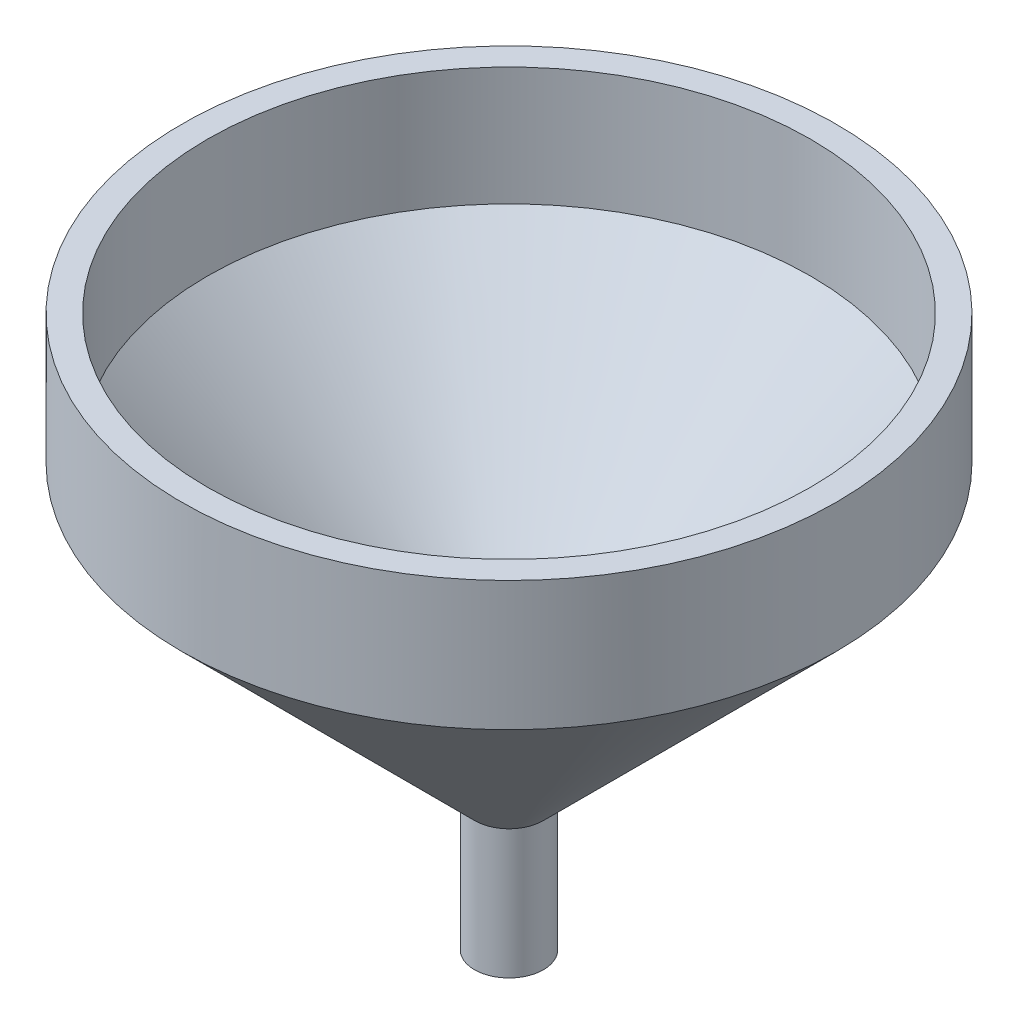
ISO-10303-21;
HEADER;
FILE_DESCRIPTION(('STEP AP214'),'2;1');
FILE_NAME('part.step','',(''),(''),'','','');
FILE_SCHEMA(('AUTOMOTIVE_DESIGN { 1 0 10303 214 1 1 1 1 }'));
ENDSEC;
DATA;
#1=APPLICATION_CONTEXT('core data for automotive mechanical design processes');
#2=APPLICATION_PROTOCOL_DEFINITION('international standard','automotive_design',2000,#1);
#3=PRODUCT_CONTEXT('',#1,'mechanical');
#4=PRODUCT('Part','Part','',(#3));
#5=PRODUCT_RELATED_PRODUCT_CATEGORY('part','',(#4));
#6=PRODUCT_DEFINITION_FORMATION('','',#4);
#7=PRODUCT_DEFINITION_CONTEXT('part definition',#1,'design');
#8=PRODUCT_DEFINITION('design','',#6,#7);
#9=PRODUCT_DEFINITION_SHAPE('','',#8);
#10=(LENGTH_UNIT() NAMED_UNIT(*) SI_UNIT(.MILLI.,.METRE.));
#11=(NAMED_UNIT(*) PLANE_ANGLE_UNIT() SI_UNIT($,.RADIAN.));
#12=(NAMED_UNIT(*) SI_UNIT($,.STERADIAN.) SOLID_ANGLE_UNIT());
#13=UNCERTAINTY_MEASURE_WITH_UNIT(LENGTH_MEASURE(1.E-05),#10,'distance_accuracy_value','');
#14=(GEOMETRIC_REPRESENTATION_CONTEXT(3) GLOBAL_UNCERTAINTY_ASSIGNED_CONTEXT((#13)) GLOBAL_UNIT_ASSIGNED_CONTEXT((#10,
#11,#12)) REPRESENTATION_CONTEXT('',''));
#15=CARTESIAN_POINT('',(0.,0.,0.));
#16=DIRECTION('',(0.,0.,1.));
#17=DIRECTION('',(1.,0.,0.));
#18=AXIS2_PLACEMENT_3D('',#15,#16,#17);
#19=CARTESIAN_POINT('',(0.,0.,0.));
#20=DIRECTION('',(0.,1.,0.));
#21=DIRECTION('',(-1.,0.,0.));
#22=AXIS2_PLACEMENT_3D('',#19,#20,#21);
#23=PLANE('',#22);
#24=CARTESIAN_POINT('',(2.,0.,0.));
#25=DIRECTION('',(0.,-1.,0.));
#26=DIRECTION('',(1.,0.,0.));
#27=AXIS2_PLACEMENT_3D('',#24,#25,#26);
#28=CIRCLE('',#27,2.);
#29=CARTESIAN_POINT('',(4.,0.,0.));
#30=VERTEX_POINT('',#29);
#31=EDGE_CURVE('E59',#30,#30,#28,.T.);
#32=ORIENTED_EDGE('',*,*,#31,.F.);
#33=EDGE_LOOP('',(#32));
#34=FACE_BOUND('',#33,.T.);
#35=CARTESIAN_POINT('',(2.,0.,0.));
#36=DIRECTION('',(0.,-1.,0.));
#37=DIRECTION('',(1.,0.,0.));
#38=AXIS2_PLACEMENT_3D('',#35,#36,#37);
#39=CIRCLE('',#38,4.);
#40=CARTESIAN_POINT('',(6.,0.,0.));
#41=VERTEX_POINT('',#40);
#42=EDGE_CURVE('E10',#41,#41,#39,.T.);
#43=ORIENTED_EDGE('',*,*,#42,.T.);
#44=EDGE_LOOP('',(#43));
#45=FACE_BOUND('',#44,.T.);
#46=ADVANCED_FACE('F31',(#34,#45),#23,.F.);
#47=CARTESIAN_POINT('',(2.,0.,0.));
#48=DIRECTION('',(0.,-1.,0.));
#49=DIRECTION('',(1.,0.,0.));
#50=AXIS2_PLACEMENT_3D('',#47,#48,#49);
#51=CYLINDRICAL_SURFACE('',#50,3.99999999999997);
#52=ORIENTED_EDGE('',*,*,#42,.F.);
#53=EDGE_LOOP('',(#52));
#54=FACE_BOUND('',#53,.T.);
#55=CARTESIAN_POINT('',(2.00000000000002,15.0000000000001,0.));
#56=DIRECTION('',(0.,-1.,0.));
#57=DIRECTION('',(1.,0.,0.));
#58=AXIS2_PLACEMENT_3D('',#55,#56,#57);
#59=CIRCLE('',#58,3.99999999999993);
#60=CARTESIAN_POINT('',(-1.99999999999992,15.0000000000001,0.));
#61=VERTEX_POINT('',#60);
#62=EDGE_CURVE('E37',#61,#61,#59,.T.);
#63=ORIENTED_EDGE('',*,*,#62,.T.);
#64=EDGE_LOOP('',(#63));
#65=FACE_BOUND('',#64,.T.);
#66=ADVANCED_FACE('F66',(#54,#65),#51,.T.);
#67=CARTESIAN_POINT('',(2.00000000000005,49.0000000000004,0.));
#68=DIRECTION('',(0.,1.,0.));
#69=DIRECTION('',(-1.,0.,0.));
#70=AXIS2_PLACEMENT_3D('',#67,#68,#69);
#71=CONICAL_SURFACE('',#70,38.,0.785398163397445);
#72=CARTESIAN_POINT('',(2.00000000000005,49.0000000000004,0.));
#73=DIRECTION('',(0.,-1.,0.));
#74=DIRECTION('',(1.,0.,0.));
#75=AXIS2_PLACEMENT_3D('',#72,#73,#74);
#76=CIRCLE('',#75,38.);
#77=CARTESIAN_POINT('',(-35.9999999999999,49.0000000000004,0.));
#78=VERTEX_POINT('',#77);
#79=EDGE_CURVE('E41',#78,#78,#76,.T.);
#80=CARTESIAN_POINT('',(-1.99999999999992,15.0000000000001,0.));
#81=CARTESIAN_POINT('',(-2.35416666666659,15.3541666666668,0.));
#82=CARTESIAN_POINT('',(-2.70833333333325,15.7083333333334,0.));
#83=CARTESIAN_POINT('',(-3.41666666666659,16.4166666666668,0.));
#84=CARTESIAN_POINT('',(-3.77083333333325,16.7708333333334,0.));
#85=CARTESIAN_POINT('',(-4.47916666666659,17.4791666666668,0.));
#86=CARTESIAN_POINT('',(-4.83333333333326,17.8333333333334,0.));
#87=CARTESIAN_POINT('',(-5.54166666666659,18.5416666666668,0.));
#88=CARTESIAN_POINT('',(-5.89583333333326,18.8958333333335,0.));
#89=CARTESIAN_POINT('',(-6.60416666666659,19.6041666666668,0.));
#90=CARTESIAN_POINT('',(-6.95833333333326,19.9583333333335,0.));
#91=CARTESIAN_POINT('',(-7.66666666666659,20.6666666666668,0.));
#92=CARTESIAN_POINT('',(-8.02083333333326,21.0208333333335,0.));
#93=CARTESIAN_POINT('',(-8.72916666666659,21.7291666666668,0.));
#94=CARTESIAN_POINT('',(-9.08333333333326,22.0833333333335,0.));
#95=CARTESIAN_POINT('',(-9.79166666666659,22.7916666666668,0.));
#96=CARTESIAN_POINT('',(-10.1458333333333,23.1458333333335,0.));
#97=CARTESIAN_POINT('',(-10.8541666666666,23.8541666666668,0.));
#98=CARTESIAN_POINT('',(-11.2083333333333,24.2083333333335,0.));
#99=CARTESIAN_POINT('',(-11.9166666666666,24.9166666666668,0.));
#100=CARTESIAN_POINT('',(-12.2708333333333,25.2708333333335,0.));
#101=CARTESIAN_POINT('',(-12.9791666666666,25.9791666666669,0.));
#102=CARTESIAN_POINT('',(-13.3333333333333,26.3333333333335,0.));
#103=CARTESIAN_POINT('',(-14.0416666666666,27.0416666666669,0.));
#104=CARTESIAN_POINT('',(-14.3958333333333,27.3958333333335,0.));
#105=CARTESIAN_POINT('',(-15.1041666666666,28.1041666666669,0.));
#106=CARTESIAN_POINT('',(-15.4583333333333,28.4583333333335,0.));
#107=CARTESIAN_POINT('',(-16.1666666666666,29.1666666666669,0.));
#108=CARTESIAN_POINT('',(-16.5208333333333,29.5208333333336,0.));
#109=CARTESIAN_POINT('',(-17.2291666666666,30.2291666666669,0.));
#110=CARTESIAN_POINT('',(-17.5833333333333,30.5833333333336,0.));
#111=CARTESIAN_POINT('',(-18.2916666666666,31.2916666666669,0.));
#112=CARTESIAN_POINT('',(-18.6458333333333,31.6458333333336,0.));
#113=CARTESIAN_POINT('',(-19.3541666666666,32.3541666666669,0.));
#114=CARTESIAN_POINT('',(-19.7083333333333,32.7083333333336,0.));
#115=CARTESIAN_POINT('',(-20.4166666666666,33.4166666666669,0.));
#116=CARTESIAN_POINT('',(-20.7708333333333,33.7708333333336,0.));
#117=CARTESIAN_POINT('',(-21.4791666666666,34.4791666666669,0.));
#118=CARTESIAN_POINT('',(-21.8333333333333,34.8333333333336,0.));
#119=CARTESIAN_POINT('',(-22.5416666666666,35.5416666666669,0.));
#120=CARTESIAN_POINT('',(-22.8958333333333,35.8958333333336,0.));
#121=CARTESIAN_POINT('',(-23.6041666666666,36.604166666667,0.));
#122=CARTESIAN_POINT('',(-23.9583333333333,36.9583333333336,0.));
#123=CARTESIAN_POINT('',(-24.6666666666666,37.666666666667,0.));
#124=CARTESIAN_POINT('',(-25.0208333333333,38.0208333333336,0.));
#125=CARTESIAN_POINT('',(-25.7291666666666,38.729166666667,0.));
#126=CARTESIAN_POINT('',(-26.0833333333333,39.0833333333337,0.));
#127=CARTESIAN_POINT('',(-26.7916666666666,39.791666666667,0.));
#128=CARTESIAN_POINT('',(-27.1458333333333,40.1458333333337,0.));
#129=CARTESIAN_POINT('',(-27.8541666666666,40.854166666667,0.));
#130=CARTESIAN_POINT('',(-28.2083333333333,41.2083333333337,0.));
#131=CARTESIAN_POINT('',(-28.9166666666666,41.916666666667,0.));
#132=CARTESIAN_POINT('',(-29.2708333333333,42.2708333333337,0.));
#133=CARTESIAN_POINT('',(-29.9791666666666,42.979166666667,0.));
#134=CARTESIAN_POINT('',(-30.3333333333333,43.3333333333337,0.));
#135=CARTESIAN_POINT('',(-31.0416666666666,44.041666666667,0.));
#136=CARTESIAN_POINT('',(-31.3958333333333,44.3958333333337,0.));
#137=CARTESIAN_POINT('',(-32.1041666666666,45.104166666667,0.));
#138=CARTESIAN_POINT('',(-32.4583333333333,45.4583333333337,0.));
#139=CARTESIAN_POINT('',(-33.1666666666666,46.1666666666671,0.));
#140=CARTESIAN_POINT('',(-33.5208333333333,46.5208333333337,0.));
#141=CARTESIAN_POINT('',(-34.2291666666666,47.2291666666671,0.));
#142=CARTESIAN_POINT('',(-34.5833333333333,47.5833333333337,0.));
#143=CARTESIAN_POINT('',(-35.2916666666666,48.2916666666671,0.));
#144=CARTESIAN_POINT('',(-35.6458333333333,48.6458333333337,0.));
#145=CARTESIAN_POINT('',(-35.9999999999999,49.0000000000004,0.));
#146=B_SPLINE_CURVE_WITH_KNOTS('',3,(#80,#81,#82,#83,#84,#85,#86,#87,#88,#89,#90,#91,#92,#93,
#94,#95,#96,#97,#98,#99,#100,#101,#102,#103,#104,#105,#106,#107,#108,#109,#110,#111,#112,#113,
#114,#115,#116,#117,#118,#119,#120,#121,#122,#123,#124,#125,#126,#127,#128,#129,#130,#131,#132,
#133,#134,#135,#136,#137,#138,#139,#140,#141,#142,#143,#144,#145),.UNSPECIFIED.,.F.,.F.,(4,2,2,
2,2,2,2,2,2,2,2,2,2,2,2,2,2,2,2,2,2,2,2,2,2,2,2,2,2,2,2,2,4),(0.,1.50260191002142,
3.00520382004284,4.50780573006426,6.01040764008568,7.5130095501071,9.01561146012852,
10.51821337015,12.0208152801714,13.5234171901928,15.0260191002142,16.5286210102356,
18.0312229202571,19.5338248302785,21.0364267402999,22.5390286503213,24.0416305603427,
25.5442324703642,27.0468343803856,28.549436290407,30.0520382004284,31.5546401104498,
33.0572420204713,34.5598439304927,36.0624458405141,37.5650477505355,39.067649660557,
40.5702515705784,42.0728534805998,43.5754553906212,45.0780573006426,46.5806592106641,
48.0832611206855),.UNSPECIFIED.);
#147=EDGE_CURVE('BSEAM70',#61,#78,#146,.T.);
#148=ORIENTED_EDGE('',*,*,#62,.F.);
#149=ORIENTED_EDGE('',*,*,#79,.T.);
#150=ORIENTED_EDGE('',*,*,#147,.T.);
#151=ORIENTED_EDGE('',*,*,#147,.F.);
#152=EDGE_LOOP('',(#148,#150,#149,#151));
#153=FACE_BOUND('',#152,.T.);
#154=ADVANCED_FACE('F70',(#153),#71,.T.);
#155=CARTESIAN_POINT('',(2.,0.,0.));
#156=DIRECTION('',(0.,-1.,0.));
#157=DIRECTION('',(1.,0.,0.));
#158=AXIS2_PLACEMENT_3D('',#155,#156,#157);
#159=CYLINDRICAL_SURFACE('',#158,38.);
#160=ORIENTED_EDGE('',*,*,#79,.F.);
#161=EDGE_LOOP('',(#160));
#162=FACE_BOUND('',#161,.T.);
#163=CARTESIAN_POINT('',(2.00000000000006,64.0000000000004,0.));
#164=DIRECTION('',(0.,-1.,0.));
#165=DIRECTION('',(1.,0.,0.));
#166=AXIS2_PLACEMENT_3D('',#163,#164,#165);
#167=CIRCLE('',#166,38.);
#168=CARTESIAN_POINT('',(40.0000000000001,64.0000000000003,0.));
#169=VERTEX_POINT('',#168);
#170=EDGE_CURVE('E45',#169,#169,#167,.T.);
#171=ORIENTED_EDGE('',*,*,#170,.T.);
#172=EDGE_LOOP('',(#171));
#173=FACE_BOUND('',#172,.T.);
#174=ADVANCED_FACE('F75',(#162,#173),#159,.T.);
#175=CARTESIAN_POINT('',(-35.9999999999999,64.0000000000004,0.));
#176=DIRECTION('',(0.,-1.,0.));
#177=DIRECTION('',(1.,0.,0.));
#178=AXIS2_PLACEMENT_3D('',#175,#176,#177);
#179=PLANE('',#178);
#180=ORIENTED_EDGE('',*,*,#170,.F.);
#181=EDGE_LOOP('',(#180));
#182=FACE_BOUND('',#181,.T.);
#183=CARTESIAN_POINT('',(2.00000000000006,64.0000000000004,0.));
#184=DIRECTION('',(0.,-1.,0.));
#185=DIRECTION('',(1.,0.,0.));
#186=AXIS2_PLACEMENT_3D('',#183,#184,#185);
#187=CIRCLE('',#186,35.);
#188=CARTESIAN_POINT('',(37.0000000000001,64.0000000000003,0.));
#189=VERTEX_POINT('',#188);
#190=EDGE_CURVE('E50',#189,#189,#187,.T.);
#191=ORIENTED_EDGE('',*,*,#190,.T.);
#192=EDGE_LOOP('',(#191));
#193=FACE_BOUND('',#192,.T.);
#194=ADVANCED_FACE('F81',(#182,#193),#179,.F.);
#195=CARTESIAN_POINT('',(2.,0.,0.));
#196=DIRECTION('',(0.,-1.,0.));
#197=DIRECTION('',(1.,0.,0.));
#198=AXIS2_PLACEMENT_3D('',#195,#196,#197);
#199=CYLINDRICAL_SURFACE('',#198,35.);
#200=ORIENTED_EDGE('',*,*,#190,.F.);
#201=EDGE_LOOP('',(#200));
#202=FACE_BOUND('',#201,.T.);
#203=CARTESIAN_POINT('',(2.00000000000005,50.2426406871197,0.));
#204=DIRECTION('',(0.,-1.,0.));
#205=DIRECTION('',(1.,0.,0.));
#206=AXIS2_PLACEMENT_3D('',#203,#204,#205);
#207=CIRCLE('',#206,35.);
#208=CARTESIAN_POINT('',(-32.9999999999999,50.2426406871197,0.));
#209=VERTEX_POINT('',#208);
#210=EDGE_CURVE('E53',#209,#209,#207,.T.);
#211=ORIENTED_EDGE('',*,*,#210,.T.);
#212=EDGE_LOOP('',(#211));
#213=FACE_BOUND('',#212,.T.);
#214=ADVANCED_FACE('F85',(#202,#213),#199,.F.);
#215=CARTESIAN_POINT('',(2.00000000000002,17.2426406871194,0.));
#216=DIRECTION('',(0.,1.,0.));
#217=DIRECTION('',(-1.,0.,0.));
#218=AXIS2_PLACEMENT_3D('',#215,#216,#217);
#219=CONICAL_SURFACE('',#218,2.00000000000002,0.785398163397444);
#220=CARTESIAN_POINT('',(2.00000000000002,17.2426406871194,0.));
#221=DIRECTION('',(0.,-1.,0.));
#222=DIRECTION('',(1.,0.,0.));
#223=AXIS2_PLACEMENT_3D('',#220,#221,#222);
#224=CIRCLE('',#223,2.00000000000002);
#225=CARTESIAN_POINT('',(0.,17.2426406871194,0.));
#226=VERTEX_POINT('',#225);
#227=EDGE_CURVE('E56',#226,#226,#224,.T.);
#228=CARTESIAN_POINT('',(-32.9999999999999,50.2426406871197,0.));
#229=CARTESIAN_POINT('',(-32.65625,49.8988906871197,0.));
#230=CARTESIAN_POINT('',(-32.3124999999999,49.5551406871197,0.));
#231=CARTESIAN_POINT('',(-31.625,48.8676406871197,0.));
#232=CARTESIAN_POINT('',(-31.28125,48.5238906871197,0.));
#233=CARTESIAN_POINT('',(-30.59375,47.8363906871197,0.));
#234=CARTESIAN_POINT('',(-30.25,47.4926406871197,0.));
#235=CARTESIAN_POINT('',(-29.5625,46.8051406871197,0.));
#236=CARTESIAN_POINT('',(-29.21875,46.4613906871197,0.));
#237=CARTESIAN_POINT('',(-28.53125,45.7738906871197,0.));
#238=CARTESIAN_POINT('',(-28.1875,45.4301406871197,0.));
#239=CARTESIAN_POINT('',(-27.5,44.7426406871197,0.));
#240=CARTESIAN_POINT('',(-27.15625,44.3988906871197,0.));
#241=CARTESIAN_POINT('',(-26.46875,43.7113906871197,0.));
#242=CARTESIAN_POINT('',(-26.125,43.3676406871197,0.));
#243=CARTESIAN_POINT('',(-25.4375,42.6801406871197,0.));
#244=CARTESIAN_POINT('',(-25.09375,42.3363906871197,0.));
#245=CARTESIAN_POINT('',(-24.40625,41.6488906871197,0.));
#246=CARTESIAN_POINT('',(-24.0625,41.3051406871197,0.));
#247=CARTESIAN_POINT('',(-23.375,40.6176406871196,0.));
#248=CARTESIAN_POINT('',(-23.03125,40.2738906871196,0.));
#249=CARTESIAN_POINT('',(-22.34375,39.5863906871196,0.));
#250=CARTESIAN_POINT('',(-22.,39.2426406871196,0.));
#251=CARTESIAN_POINT('',(-21.3125,38.5551406871196,0.));
#252=CARTESIAN_POINT('',(-20.96875,38.2113906871196,0.));
#253=CARTESIAN_POINT('',(-20.28125,37.5238906871196,0.));
#254=CARTESIAN_POINT('',(-19.9375,37.1801406871196,0.));
#255=CARTESIAN_POINT('',(-19.25,36.4926406871196,0.));
#256=CARTESIAN_POINT('',(-18.90625,36.1488906871196,0.));
#257=CARTESIAN_POINT('',(-18.21875,35.4613906871196,0.));
#258=CARTESIAN_POINT('',(-17.875,35.1176406871196,0.));
#259=CARTESIAN_POINT('',(-17.1875,34.4301406871196,0.));
#260=CARTESIAN_POINT('',(-16.84375,34.0863906871196,0.));
#261=CARTESIAN_POINT('',(-16.15625,33.3988906871196,0.));
#262=CARTESIAN_POINT('',(-15.8125,33.0551406871196,0.));
#263=CARTESIAN_POINT('',(-15.125,32.3676406871196,0.));
#264=CARTESIAN_POINT('',(-14.78125,32.0238906871196,0.));
#265=CARTESIAN_POINT('',(-14.09375,31.3363906871196,0.));
#266=CARTESIAN_POINT('',(-13.75,30.9926406871196,0.));
#267=CARTESIAN_POINT('',(-13.0625,30.3051406871196,0.));
#268=CARTESIAN_POINT('',(-12.71875,29.9613906871196,0.));
#269=CARTESIAN_POINT('',(-12.03125,29.2738906871195,0.));
#270=CARTESIAN_POINT('',(-11.6875,28.9301406871195,0.));
#271=CARTESIAN_POINT('',(-11.,28.2426406871195,0.));
#272=CARTESIAN_POINT('',(-10.65625,27.8988906871195,0.));
#273=CARTESIAN_POINT('',(-9.96874999999998,27.2113906871195,0.));
#274=CARTESIAN_POINT('',(-9.62499999999999,26.8676406871195,0.));
#275=CARTESIAN_POINT('',(-8.93749999999999,26.1801406871195,0.));
#276=CARTESIAN_POINT('',(-8.59374999999999,25.8363906871195,0.));
#277=CARTESIAN_POINT('',(-7.90624999999999,25.1488906871195,0.));
#278=CARTESIAN_POINT('',(-7.56249999999999,24.8051406871195,0.));
#279=CARTESIAN_POINT('',(-6.87499999999999,24.1176406871195,0.));
#280=CARTESIAN_POINT('',(-6.53124999999999,23.7738906871195,0.));
#281=CARTESIAN_POINT('',(-5.84374999999999,23.0863906871195,0.));
#282=CARTESIAN_POINT('',(-5.49999999999999,22.7426406871195,0.));
#283=CARTESIAN_POINT('',(-4.81249999999999,22.0551406871195,0.));
#284=CARTESIAN_POINT('',(-4.46874999999999,21.7113906871195,0.));
#285=CARTESIAN_POINT('',(-3.78124999999999,21.0238906871195,0.));
#286=CARTESIAN_POINT('',(-3.4375,20.6801406871195,0.));
#287=CARTESIAN_POINT('',(-2.75,19.9926406871195,0.));
#288=CARTESIAN_POINT('',(-2.40625,19.6488906871195,0.));
#289=CARTESIAN_POINT('',(-1.71875,18.9613906871194,0.));
#290=CARTESIAN_POINT('',(-1.375,18.6176406871194,0.));
#291=CARTESIAN_POINT('',(-0.687500000000001,17.9301406871194,0.));
#292=CARTESIAN_POINT('',(-0.343750000000001,17.5863906871194,0.));
#293=CARTESIAN_POINT('',(0.,17.2426406871194,0.));
#294=B_SPLINE_CURVE_WITH_KNOTS('',3,(#228,#229,#230,#231,#232,#233,#234,#235,#236,#237,#238,
#239,#240,#241,#242,#243,#244,#245,#246,#247,#248,#249,#250,#251,#252,#253,#254,#255,#256,#257,
#258,#259,#260,#261,#262,#263,#264,#265,#266,#267,#268,#269,#270,#271,#272,#273,#274,#275,#276,
#277,#278,#279,#280,#281,#282,#283,#284,#285,#286,#287,#288,#289,#290,#291,#292,#293),
.UNSPECIFIED.,.F.,.F.,(4,2,2,2,2,2,2,2,2,2,2,2,2,2,2,2,2,2,2,2,2,2,2,2,2,2,2,2,2,2,2,2,4),(0.,
1.45840773619726,2.91681547239451,4.37522320859178,5.83363094478904,7.29203868098629,
8.75044641718356,10.2088541533808,11.6672618895781,13.1256696257753,14.5840773619726,
16.0424850981699,17.5008928343671,18.9593005705644,20.4177083067616,21.8761160429589,
23.3345237791562,24.7929315153534,26.2513392515507,27.7097469877479,29.1681547239452,
30.6265624601425,32.0849701963397,33.543377932537,35.0017856687342,36.4601934049315,
37.9186011411288,39.377008877326,40.8354166135233,42.2938243497205,43.7522320859178,
45.2106398221151,46.6690475583123),.UNSPECIFIED.);
#295=EDGE_CURVE('BSEAM89',#209,#226,#294,.T.);
#296=ORIENTED_EDGE('',*,*,#210,.F.);
#297=ORIENTED_EDGE('',*,*,#227,.T.);
#298=ORIENTED_EDGE('',*,*,#295,.T.);
#299=ORIENTED_EDGE('',*,*,#295,.F.);
#300=EDGE_LOOP('',(#296,#298,#297,#299));
#301=FACE_BOUND('',#300,.T.);
#302=ADVANCED_FACE('F89',(#301),#219,.F.);
#303=CARTESIAN_POINT('',(2.,0.,0.));
#304=DIRECTION('',(0.,-1.,0.));
#305=DIRECTION('',(1.,0.,0.));
#306=AXIS2_PLACEMENT_3D('',#303,#304,#305);
#307=CYLINDRICAL_SURFACE('',#306,2.00000000000001);
#308=ORIENTED_EDGE('',*,*,#227,.F.);
#309=EDGE_LOOP('',(#308));
#310=FACE_BOUND('',#309,.T.);
#311=ORIENTED_EDGE('',*,*,#31,.T.);
#312=EDGE_LOOP('',(#311));
#313=FACE_BOUND('',#312,.T.);
#314=ADVANCED_FACE('F63',(#310,#313),#307,.F.);
#315=CLOSED_SHELL('',(#46,#66,#154,#174,#194,#214,#302,#314));
#316=MANIFOLD_SOLID_BREP('B2',#315);
#317=ADVANCED_BREP_SHAPE_REPRESENTATION('',(#18,#316),#14);
#318=SHAPE_DEFINITION_REPRESENTATION(#9,#317);
ENDSEC;
END-ISO-10303-21;
